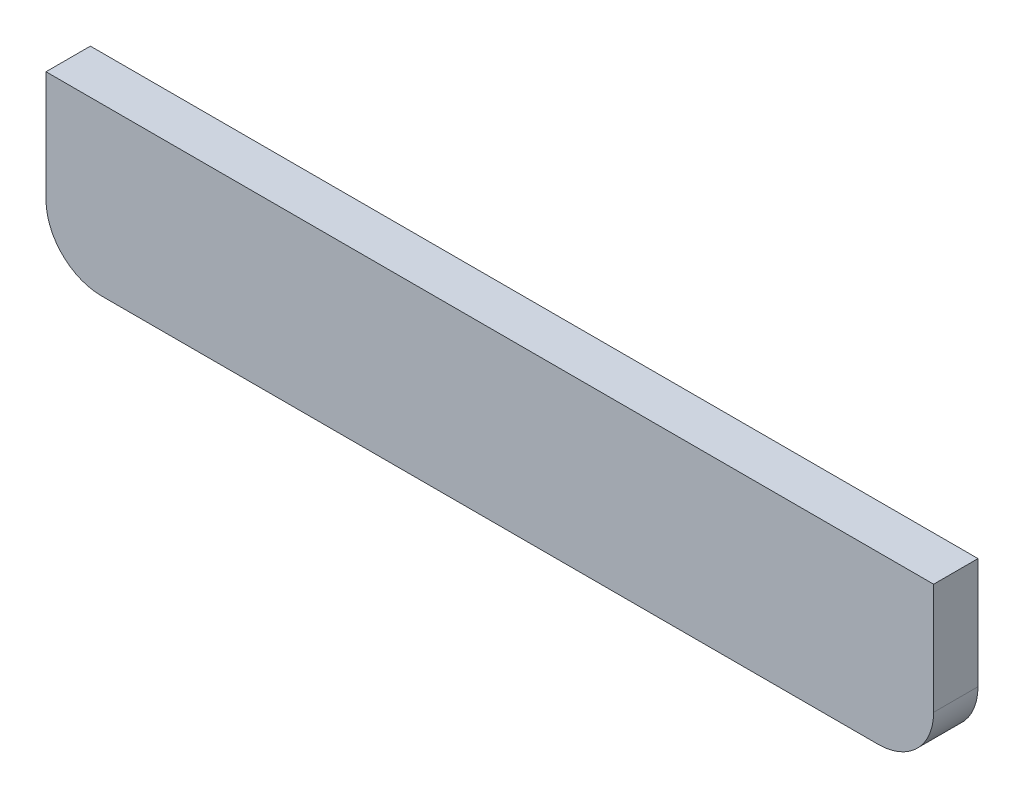
ISO-10303-21;
HEADER;
FILE_DESCRIPTION(('STEP AP214'),'2;1');
FILE_NAME('part.step','',(''),(''),'','','');
FILE_SCHEMA(('AUTOMOTIVE_DESIGN { 1 0 10303 214 1 1 1 1 }'));
ENDSEC;
DATA;
#1=APPLICATION_CONTEXT('core data for automotive mechanical design processes');
#2=APPLICATION_PROTOCOL_DEFINITION('international standard','automotive_design',2000,#1);
#3=PRODUCT_CONTEXT('',#1,'mechanical');
#4=PRODUCT('Part','Part','',(#3));
#5=PRODUCT_RELATED_PRODUCT_CATEGORY('part','',(#4));
#6=PRODUCT_DEFINITION_FORMATION('','',#4);
#7=PRODUCT_DEFINITION_CONTEXT('part definition',#1,'design');
#8=PRODUCT_DEFINITION('design','',#6,#7);
#9=PRODUCT_DEFINITION_SHAPE('','',#8);
#10=(LENGTH_UNIT() NAMED_UNIT(*) SI_UNIT(.MILLI.,.METRE.));
#11=(NAMED_UNIT(*) PLANE_ANGLE_UNIT() SI_UNIT($,.RADIAN.));
#12=(NAMED_UNIT(*) SI_UNIT($,.STERADIAN.) SOLID_ANGLE_UNIT());
#13=UNCERTAINTY_MEASURE_WITH_UNIT(LENGTH_MEASURE(1.E-05),#10,'distance_accuracy_value','');
#14=(GEOMETRIC_REPRESENTATION_CONTEXT(3) GLOBAL_UNCERTAINTY_ASSIGNED_CONTEXT((#13)) GLOBAL_UNIT_ASSIGNED_CONTEXT((#10,
#11,#12)) REPRESENTATION_CONTEXT('',''));
#15=CARTESIAN_POINT('',(0.,0.,0.));
#16=DIRECTION('',(0.,0.,1.));
#17=DIRECTION('',(1.,0.,0.));
#18=AXIS2_PLACEMENT_3D('',#15,#16,#17);
#19=CARTESIAN_POINT('',(-80.,-15.,4.));
#20=DIRECTION('',(1.,0.,0.));
#21=DIRECTION('',(0.,1.,0.));
#22=AXIS2_PLACEMENT_3D('',#19,#20,#21);
#23=PLANE('',#22);
#24=DIRECTION('',(0.,-1.,0.));
#25=VECTOR('',#24,1.);
#26=CARTESIAN_POINT('',(-80.,-15.,-4.));
#27=LINE('',#26,#25);
#28=CARTESIAN_POINT('',(-80.,15.,-4.));
#29=VERTEX_POINT('',#28);
#30=CARTESIAN_POINT('',(-80.,-5.,-4.));
#31=VERTEX_POINT('',#30);
#32=EDGE_CURVE('E115',#29,#31,#27,.T.);
#33=ORIENTED_EDGE('',*,*,#32,.T.);
#34=DIRECTION('',(0.,0.,-1.));
#35=VECTOR('',#34,1.);
#36=CARTESIAN_POINT('',(-80.,-5.,4.));
#37=LINE('',#36,#35);
#38=CARTESIAN_POINT('',(-80.,-5.,4.));
#39=VERTEX_POINT('',#38);
#40=EDGE_CURVE('E11',#31,#39,#37,.F.);
#41=ORIENTED_EDGE('',*,*,#40,.T.);
#42=DIRECTION('',(0.,-1.,0.));
#43=VECTOR('',#42,1.);
#44=CARTESIAN_POINT('',(-80.,-15.,4.));
#45=LINE('',#44,#43);
#46=CARTESIAN_POINT('',(-80.,15.,4.));
#47=VERTEX_POINT('',#46);
#48=EDGE_CURVE('E121',#47,#39,#45,.T.);
#49=ORIENTED_EDGE('',*,*,#48,.F.);
#50=DIRECTION('',(0.,0.,-1.));
#51=VECTOR('',#50,1.);
#52=CARTESIAN_POINT('',(-80.,15.,4.));
#53=LINE('',#52,#51);
#54=EDGE_CURVE('E107',#47,#29,#53,.T.);
#55=ORIENTED_EDGE('',*,*,#54,.T.);
#56=EDGE_LOOP('',(#33,#41,#49,#55));
#57=FACE_BOUND('',#56,.T.);
#58=ADVANCED_FACE('F33',(#57),#23,.F.);
#59=CARTESIAN_POINT('',(80.,-15.,4.));
#60=DIRECTION('',(0.,1.,0.));
#61=DIRECTION('',(-1.,0.,0.));
#62=AXIS2_PLACEMENT_3D('',#59,#60,#61);
#63=PLANE('',#62);
#64=DIRECTION('',(1.,0.,0.));
#65=VECTOR('',#64,1.);
#66=CARTESIAN_POINT('',(80.,-15.,-4.));
#67=LINE('',#66,#65);
#68=CARTESIAN_POINT('',(-70.,-15.,-4.));
#69=VERTEX_POINT('',#68);
#70=CARTESIAN_POINT('',(70.,-15.,-4.));
#71=VERTEX_POINT('',#70);
#72=EDGE_CURVE('E117',#69,#71,#67,.T.);
#73=ORIENTED_EDGE('',*,*,#72,.T.);
#74=DIRECTION('',(0.,0.,-1.));
#75=VECTOR('',#74,1.);
#76=CARTESIAN_POINT('',(70.,-15.,4.));
#77=LINE('',#76,#75);
#78=CARTESIAN_POINT('',(70.,-15.,4.));
#79=VERTEX_POINT('',#78);
#80=EDGE_CURVE('E54',#71,#79,#77,.F.);
#81=ORIENTED_EDGE('',*,*,#80,.T.);
#82=DIRECTION('',(1.,0.,0.));
#83=VECTOR('',#82,1.);
#84=CARTESIAN_POINT('',(80.,-15.,4.));
#85=LINE('',#84,#83);
#86=CARTESIAN_POINT('',(-70.,-15.,4.));
#87=VERTEX_POINT('',#86);
#88=EDGE_CURVE('E97',#87,#79,#85,.T.);
#89=ORIENTED_EDGE('',*,*,#88,.F.);
#90=DIRECTION('',(0.,0.,-1.));
#91=VECTOR('',#90,1.);
#92=CARTESIAN_POINT('',(-70.,-15.,4.));
#93=LINE('',#92,#91);
#94=EDGE_CURVE('E128',#87,#69,#93,.T.);
#95=ORIENTED_EDGE('',*,*,#94,.T.);
#96=EDGE_LOOP('',(#73,#81,#89,#95));
#97=FACE_BOUND('',#96,.T.);
#98=ADVANCED_FACE('F136',(#97),#63,.F.);
#99=CARTESIAN_POINT('',(80.,-15.,4.));
#100=DIRECTION('',(-1.,0.,0.));
#101=DIRECTION('',(0.,0.,1.));
#102=AXIS2_PLACEMENT_3D('',#99,#100,#101);
#103=PLANE('',#102);
#104=DIRECTION('',(0.,1.,0.));
#105=VECTOR('',#104,1.);
#106=CARTESIAN_POINT('',(80.,-15.,4.));
#107=LINE('',#106,#105);
#108=CARTESIAN_POINT('',(80.,-4.99999999999999,4.));
#109=VERTEX_POINT('',#108);
#110=CARTESIAN_POINT('',(80.,15.,4.));
#111=VERTEX_POINT('',#110);
#112=EDGE_CURVE('E87',#109,#111,#107,.T.);
#113=ORIENTED_EDGE('',*,*,#112,.F.);
#114=DIRECTION('',(0.,0.,-1.));
#115=VECTOR('',#114,1.);
#116=CARTESIAN_POINT('',(80.,-4.99999999999999,4.));
#117=LINE('',#116,#115);
#118=CARTESIAN_POINT('',(80.,-4.99999999999999,-4.));
#119=VERTEX_POINT('',#118);
#120=EDGE_CURVE('E106',#109,#119,#117,.T.);
#121=ORIENTED_EDGE('',*,*,#120,.T.);
#122=DIRECTION('',(0.,1.,0.));
#123=VECTOR('',#122,1.);
#124=CARTESIAN_POINT('',(80.,-15.,-4.));
#125=LINE('',#124,#123);
#126=CARTESIAN_POINT('',(80.,15.,-4.));
#127=VERTEX_POINT('',#126);
#128=EDGE_CURVE('E103',#119,#127,#125,.T.);
#129=ORIENTED_EDGE('',*,*,#128,.T.);
#130=DIRECTION('',(0.,0.,-1.));
#131=VECTOR('',#130,1.);
#132=CARTESIAN_POINT('',(80.,15.,4.));
#133=LINE('',#132,#131);
#134=EDGE_CURVE('E100',#111,#127,#133,.T.);
#135=ORIENTED_EDGE('',*,*,#134,.F.);
#136=EDGE_LOOP('',(#113,#121,#129,#135));
#137=FACE_BOUND('',#136,.T.);
#138=ADVANCED_FACE('F101',(#137),#103,.F.);
#139=CARTESIAN_POINT('',(80.,15.,4.));
#140=DIRECTION('',(0.,-1.,0.));
#141=DIRECTION('',(1.,0.,0.));
#142=AXIS2_PLACEMENT_3D('',#139,#140,#141);
#143=PLANE('',#142);
#144=DIRECTION('',(-1.,0.,0.));
#145=VECTOR('',#144,1.);
#146=CARTESIAN_POINT('',(80.,15.,-4.));
#147=LINE('',#146,#145);
#148=EDGE_CURVE('E120',#127,#29,#147,.T.);
#149=ORIENTED_EDGE('',*,*,#148,.T.);
#150=ORIENTED_EDGE('',*,*,#54,.F.);
#151=DIRECTION('',(-1.,0.,0.));
#152=VECTOR('',#151,1.);
#153=CARTESIAN_POINT('',(80.,15.,4.));
#154=LINE('',#153,#152);
#155=EDGE_CURVE('E91',#111,#47,#154,.T.);
#156=ORIENTED_EDGE('',*,*,#155,.F.);
#157=ORIENTED_EDGE('',*,*,#134,.T.);
#158=EDGE_LOOP('',(#149,#150,#156,#157));
#159=FACE_BOUND('',#158,.T.);
#160=ADVANCED_FACE('F109',(#159),#143,.F.);
#161=CARTESIAN_POINT('',(0.,0.,4.));
#162=DIRECTION('',(0.,0.,1.));
#163=DIRECTION('',(1.,0.,0.));
#164=AXIS2_PLACEMENT_3D('',#161,#162,#163);
#165=PLANE('',#164);
#166=ORIENTED_EDGE('',*,*,#88,.T.);
#167=CARTESIAN_POINT('',(70.,-4.99999999999999,4.));
#168=DIRECTION('',(0.,0.,1.));
#169=DIRECTION('',(1.,0.,0.));
#170=AXIS2_PLACEMENT_3D('',#167,#168,#169);
#171=CIRCLE('',#170,10.);
#172=EDGE_CURVE('E41',#79,#109,#171,.T.);
#173=ORIENTED_EDGE('',*,*,#172,.T.);
#174=ORIENTED_EDGE('',*,*,#112,.T.);
#175=ORIENTED_EDGE('',*,*,#155,.T.);
#176=ORIENTED_EDGE('',*,*,#48,.T.);
#177=CARTESIAN_POINT('',(-70.,-5.00000000000001,4.));
#178=DIRECTION('',(0.,0.,1.));
#179=DIRECTION('',(1.,0.,0.));
#180=AXIS2_PLACEMENT_3D('',#177,#178,#179);
#181=CIRCLE('',#180,10.);
#182=EDGE_CURVE('E132',#39,#87,#181,.T.);
#183=ORIENTED_EDGE('',*,*,#182,.T.);
#184=EDGE_LOOP('',(#166,#173,#174,#175,#176,#183));
#185=FACE_BOUND('',#184,.T.);
#186=ADVANCED_FACE('F89',(#185),#165,.T.);
#187=CARTESIAN_POINT('',(0.,0.,-4.));
#188=DIRECTION('',(0.,0.,1.));
#189=DIRECTION('',(1.,0.,0.));
#190=AXIS2_PLACEMENT_3D('',#187,#188,#189);
#191=PLANE('',#190);
#192=ORIENTED_EDGE('',*,*,#128,.F.);
#193=CARTESIAN_POINT('',(70.,-4.99999999999999,-4.));
#194=DIRECTION('',(0.,0.,1.));
#195=DIRECTION('',(1.,0.,0.));
#196=AXIS2_PLACEMENT_3D('',#193,#194,#195);
#197=CIRCLE('',#196,10.);
#198=EDGE_CURVE('E126',#119,#71,#197,.F.);
#199=ORIENTED_EDGE('',*,*,#198,.T.);
#200=ORIENTED_EDGE('',*,*,#72,.F.);
#201=CARTESIAN_POINT('',(-70.,-5.00000000000001,-4.));
#202=DIRECTION('',(0.,0.,1.));
#203=DIRECTION('',(1.,0.,0.));
#204=AXIS2_PLACEMENT_3D('',#201,#202,#203);
#205=CIRCLE('',#204,10.);
#206=EDGE_CURVE('E124',#69,#31,#205,.F.);
#207=ORIENTED_EDGE('',*,*,#206,.T.);
#208=ORIENTED_EDGE('',*,*,#32,.F.);
#209=ORIENTED_EDGE('',*,*,#148,.F.);
#210=EDGE_LOOP('',(#192,#199,#200,#207,#208,#209));
#211=FACE_BOUND('',#210,.T.);
#212=ADVANCED_FACE('F140',(#211),#191,.F.);
#213=CARTESIAN_POINT('',(70.,-4.99999999999999,4.));
#214=DIRECTION('',(0.,0.,-1.));
#215=DIRECTION('',(-1.,0.,0.));
#216=AXIS2_PLACEMENT_3D('',#213,#214,#215);
#217=CYLINDRICAL_SURFACE('',#216,10.);
#218=ORIENTED_EDGE('',*,*,#172,.F.);
#219=ORIENTED_EDGE('',*,*,#80,.F.);
#220=ORIENTED_EDGE('',*,*,#198,.F.);
#221=ORIENTED_EDGE('',*,*,#120,.F.);
#222=EDGE_LOOP('',(#218,#219,#220,#221));
#223=FACE_BOUND('',#222,.T.);
#224=ADVANCED_FACE('F149',(#223),#217,.T.);
#225=CARTESIAN_POINT('',(-70.,-5.00000000000001,4.));
#226=DIRECTION('',(0.,0.,-1.));
#227=DIRECTION('',(-1.,0.,0.));
#228=AXIS2_PLACEMENT_3D('',#225,#226,#227);
#229=CYLINDRICAL_SURFACE('',#228,10.);
#230=ORIENTED_EDGE('',*,*,#182,.F.);
#231=ORIENTED_EDGE('',*,*,#40,.F.);
#232=ORIENTED_EDGE('',*,*,#206,.F.);
#233=ORIENTED_EDGE('',*,*,#94,.F.);
#234=EDGE_LOOP('',(#230,#231,#232,#233));
#235=FACE_BOUND('',#234,.T.);
#236=ADVANCED_FACE('F35',(#235),#229,.T.);
#237=CLOSED_SHELL('',(#58,#98,#138,#160,#186,#212,#224,#236));
#238=MANIFOLD_SOLID_BREP('B2',#237);
#239=ADVANCED_BREP_SHAPE_REPRESENTATION('',(#18,#238),#14);
#240=SHAPE_DEFINITION_REPRESENTATION(#9,#239);
ENDSEC;
END-ISO-10303-21;
